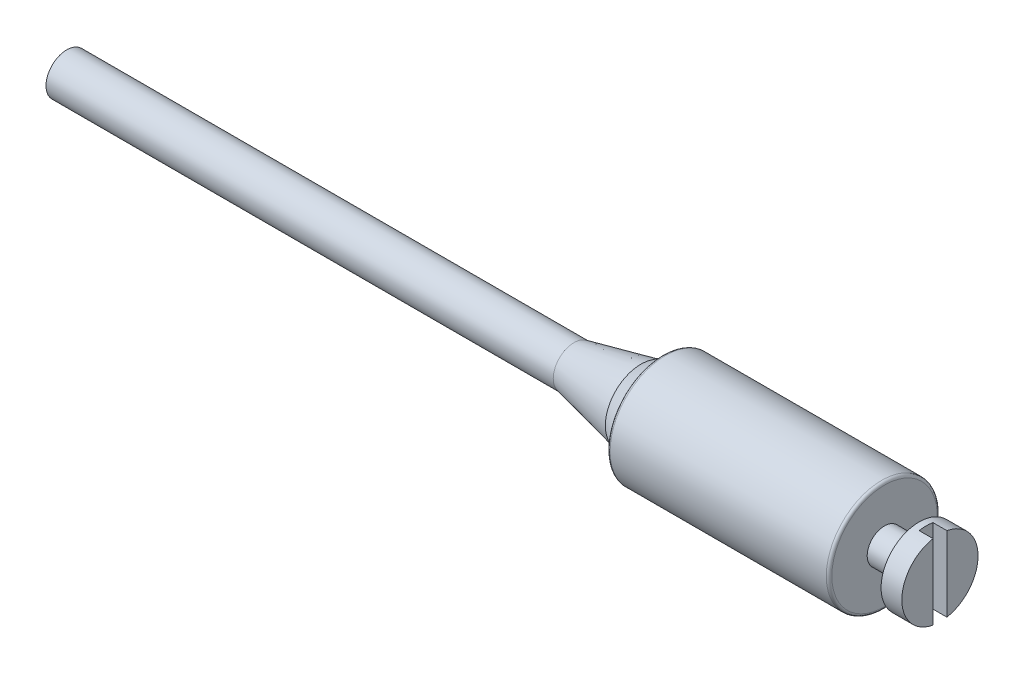
ISO-10303-21;
HEADER;
FILE_DESCRIPTION(('STEP AP214'),'2;1');
FILE_NAME('part.step','',(''),(''),'','','');
FILE_SCHEMA(('AUTOMOTIVE_DESIGN { 1 0 10303 214 1 1 1 1 }'));
ENDSEC;
DATA;
#1=APPLICATION_CONTEXT('core data for automotive mechanical design processes');
#2=APPLICATION_PROTOCOL_DEFINITION('international standard','automotive_design',2000,#1);
#3=PRODUCT_CONTEXT('',#1,'mechanical');
#4=PRODUCT('Part','Part','',(#3));
#5=PRODUCT_RELATED_PRODUCT_CATEGORY('part','',(#4));
#6=PRODUCT_DEFINITION_FORMATION('','',#4);
#7=PRODUCT_DEFINITION_CONTEXT('part definition',#1,'design');
#8=PRODUCT_DEFINITION('design','',#6,#7);
#9=PRODUCT_DEFINITION_SHAPE('','',#8);
#10=(LENGTH_UNIT() NAMED_UNIT(*) SI_UNIT(.MILLI.,.METRE.));
#11=(NAMED_UNIT(*) PLANE_ANGLE_UNIT() SI_UNIT($,.RADIAN.));
#12=(NAMED_UNIT(*) SI_UNIT($,.STERADIAN.) SOLID_ANGLE_UNIT());
#13=UNCERTAINTY_MEASURE_WITH_UNIT(LENGTH_MEASURE(1.E-05),#10,'distance_accuracy_value','');
#14=(GEOMETRIC_REPRESENTATION_CONTEXT(3) GLOBAL_UNCERTAINTY_ASSIGNED_CONTEXT((#13)) GLOBAL_UNIT_ASSIGNED_CONTEXT((#10,
#11,#12)) REPRESENTATION_CONTEXT('',''));
#15=CARTESIAN_POINT('',(0.,0.,0.));
#16=DIRECTION('',(0.,0.,1.));
#17=DIRECTION('',(1.,0.,0.));
#18=AXIS2_PLACEMENT_3D('',#15,#16,#17);
#19=CARTESIAN_POINT('',(20.,0.,0.));
#20=DIRECTION('',(-1.,0.,0.));
#21=DIRECTION('',(0.,0.,1.));
#22=AXIS2_PLACEMENT_3D('',#19,#20,#21);
#23=PLANE('',#22);
#24=CARTESIAN_POINT('',(20.,0.,0.));
#25=DIRECTION('',(-1.,0.,0.));
#26=DIRECTION('',(0.,0.,1.));
#27=AXIS2_PLACEMENT_3D('',#24,#25,#26);
#28=CIRCLE('',#27,2.75);
#29=CARTESIAN_POINT('',(20.,-2.70416345659799,0.5));
#30=VERTEX_POINT('',#29);
#31=CARTESIAN_POINT('',(20.,2.70416345659799,0.5));
#32=VERTEX_POINT('',#31);
#33=EDGE_CURVE('E90',#30,#32,#28,.T.);
#34=ORIENTED_EDGE('',*,*,#33,.F.);
#35=DIRECTION('',(0.,-1.,0.));
#36=VECTOR('',#35,1.);
#37=CARTESIAN_POINT('',(20.,-2.99260677888091,0.5));
#38=LINE('',#37,#36);
#39=EDGE_CURVE('E83',#32,#30,#38,.T.);
#40=ORIENTED_EDGE('',*,*,#39,.F.);
#41=EDGE_LOOP('',(#34,#40));
#42=FACE_BOUND('',#41,.T.);
#43=ADVANCED_FACE('F41',(#42),#23,.F.);
#44=CARTESIAN_POINT('',(-43.,1.5,0.));
#45=DIRECTION('',(1.,0.,0.));
#46=DIRECTION('',(0.,0.,-1.));
#47=AXIS2_PLACEMENT_3D('',#44,#45,#46);
#48=PLANE('',#47);
#49=CARTESIAN_POINT('',(-43.,0.,0.));
#50=DIRECTION('',(-1.,0.,0.));
#51=DIRECTION('',(0.,0.,1.));
#52=AXIS2_PLACEMENT_3D('',#49,#50,#51);
#53=CIRCLE('',#52,1.5);
#54=CARTESIAN_POINT('',(-43.,0.,1.5));
#55=VERTEX_POINT('',#54);
#56=EDGE_CURVE('E141',#55,#55,#53,.T.);
#57=ORIENTED_EDGE('',*,*,#56,.T.);
#58=EDGE_LOOP('',(#57));
#59=FACE_BOUND('',#58,.T.);
#60=ADVANCED_FACE('F183',(#59),#48,.F.);
#61=CARTESIAN_POINT('',(20.,2.70416345659799,-0.5));
#62=VERTEX_POINT('',#61);
#63=CARTESIAN_POINT('',(20.,-2.70416345659799,-0.5));
#64=VERTEX_POINT('',#63);
#65=EDGE_CURVE('E99',#62,#64,#28,.T.);
#66=ORIENTED_EDGE('',*,*,#65,.F.);
#67=DIRECTION('',(0.,1.,0.));
#68=VECTOR('',#67,1.);
#69=CARTESIAN_POINT('',(20.,-2.99260677888091,-0.5));
#70=LINE('',#69,#68);
#71=EDGE_CURVE('E92',#64,#62,#70,.T.);
#72=ORIENTED_EDGE('',*,*,#71,.F.);
#73=EDGE_LOOP('',(#66,#72));
#74=FACE_BOUND('',#73,.T.);
#75=ADVANCED_FACE('F178',(#74),#23,.F.);
#76=CARTESIAN_POINT('',(-43.,0.,0.));
#77=DIRECTION('',(-1.,0.,0.));
#78=DIRECTION('',(0.,0.,1.));
#79=AXIS2_PLACEMENT_3D('',#76,#77,#78);
#80=CYLINDRICAL_SURFACE('',#79,2.75);
#81=ORIENTED_EDGE('',*,*,#33,.T.);
#82=DIRECTION('',(-1.,0.,0.));
#83=VECTOR('',#82,1.);
#84=CARTESIAN_POINT('',(-43.,2.70416345659799,0.5));
#85=LINE('',#84,#83);
#86=CARTESIAN_POINT('',(19.,2.70416345659799,0.5));
#87=VERTEX_POINT('',#86);
#88=EDGE_CURVE('E11',#32,#87,#85,.T.);
#89=ORIENTED_EDGE('',*,*,#88,.T.);
#90=CARTESIAN_POINT('',(19.,0.,0.));
#91=DIRECTION('',(-1.,0.,0.));
#92=DIRECTION('',(0.,0.,1.));
#93=AXIS2_PLACEMENT_3D('',#90,#91,#92);
#94=CIRCLE('',#93,2.75);
#95=CARTESIAN_POINT('',(19.,2.70416345659799,-0.5));
#96=VERTEX_POINT('',#95);
#97=EDGE_CURVE('E130',#87,#96,#94,.T.);
#98=ORIENTED_EDGE('',*,*,#97,.T.);
#99=DIRECTION('',(-1.,0.,0.));
#100=VECTOR('',#99,1.);
#101=CARTESIAN_POINT('',(-43.,2.70416345659799,-0.5));
#102=LINE('',#101,#100);
#103=EDGE_CURVE('E50',#96,#62,#102,.F.);
#104=ORIENTED_EDGE('',*,*,#103,.T.);
#105=ORIENTED_EDGE('',*,*,#65,.T.);
#106=DIRECTION('',(-1.,0.,0.));
#107=VECTOR('',#106,1.);
#108=CARTESIAN_POINT('',(-43.,-2.70416345659799,-0.5));
#109=LINE('',#108,#107);
#110=CARTESIAN_POINT('',(19.,-2.70416345659799,-0.5));
#111=VERTEX_POINT('',#110);
#112=EDGE_CURVE('E129',#64,#111,#109,.T.);
#113=ORIENTED_EDGE('',*,*,#112,.T.);
#114=CARTESIAN_POINT('',(19.,-2.70416345659799,0.5));
#115=VERTEX_POINT('',#114);
#116=EDGE_CURVE('E126',#111,#115,#94,.T.);
#117=ORIENTED_EDGE('',*,*,#116,.T.);
#118=DIRECTION('',(-1.,0.,0.));
#119=VECTOR('',#118,1.);
#120=CARTESIAN_POINT('',(-43.,-2.70416345659799,0.5));
#121=LINE('',#120,#119);
#122=EDGE_CURVE('E97',#115,#30,#121,.F.);
#123=ORIENTED_EDGE('',*,*,#122,.T.);
#124=EDGE_LOOP('',(#81,#89,#98,#104,#105,#113,#117,#123));
#125=FACE_BOUND('',#124,.T.);
#126=CARTESIAN_POINT('',(18.5,0.,0.));
#127=DIRECTION('',(-1.,0.,0.));
#128=DIRECTION('',(0.,0.,1.));
#129=AXIS2_PLACEMENT_3D('',#126,#127,#128);
#130=CIRCLE('',#129,2.75);
#131=CARTESIAN_POINT('',(18.5,0.,2.75));
#132=VERTEX_POINT('',#131);
#133=EDGE_CURVE('E100',#132,#132,#130,.T.);
#134=ORIENTED_EDGE('',*,*,#133,.F.);
#135=EDGE_LOOP('',(#134));
#136=FACE_BOUND('',#135,.T.);
#137=ADVANCED_FACE('F94',(#125,#136),#80,.T.);
#138=CARTESIAN_POINT('',(18.5,2.75,0.));
#139=DIRECTION('',(1.,0.,0.));
#140=DIRECTION('',(0.,0.,-1.));
#141=AXIS2_PLACEMENT_3D('',#138,#139,#140);
#142=PLANE('',#141);
#143=CARTESIAN_POINT('',(18.5,0.,0.));
#144=DIRECTION('',(-1.,0.,0.));
#145=DIRECTION('',(0.,0.,1.));
#146=AXIS2_PLACEMENT_3D('',#143,#144,#145);
#147=CIRCLE('',#146,1.25);
#148=CARTESIAN_POINT('',(18.5,0.,1.25));
#149=VERTEX_POINT('',#148);
#150=EDGE_CURVE('E107',#149,#149,#147,.T.);
#151=ORIENTED_EDGE('',*,*,#150,.F.);
#152=EDGE_LOOP('',(#151));
#153=FACE_BOUND('',#152,.T.);
#154=ORIENTED_EDGE('',*,*,#133,.T.);
#155=EDGE_LOOP('',(#154));
#156=FACE_BOUND('',#155,.T.);
#157=ADVANCED_FACE('F172',(#153,#156),#142,.F.);
#158=CARTESIAN_POINT('',(-43.,0.,0.));
#159=DIRECTION('',(-1.,0.,0.));
#160=DIRECTION('',(0.,0.,1.));
#161=AXIS2_PLACEMENT_3D('',#158,#159,#160);
#162=CYLINDRICAL_SURFACE('',#161,1.25);
#163=CARTESIAN_POINT('',(16.,0.,0.));
#164=DIRECTION('',(-1.,0.,0.));
#165=DIRECTION('',(0.,0.,1.));
#166=AXIS2_PLACEMENT_3D('',#163,#164,#165);
#167=CIRCLE('',#166,1.25);
#168=CARTESIAN_POINT('',(16.,0.,1.25));
#169=VERTEX_POINT('',#168);
#170=EDGE_CURVE('E163',#169,#169,#167,.T.);
#171=ORIENTED_EDGE('',*,*,#170,.F.);
#172=EDGE_LOOP('',(#171));
#173=FACE_BOUND('',#172,.T.);
#174=ORIENTED_EDGE('',*,*,#150,.T.);
#175=EDGE_LOOP('',(#174));
#176=FACE_BOUND('',#175,.T.);
#177=ADVANCED_FACE('F170',(#173,#176),#162,.T.);
#178=CARTESIAN_POINT('',(16.,1.25,0.));
#179=DIRECTION('',(-1.,0.,0.));
#180=DIRECTION('',(0.,0.,1.));
#181=AXIS2_PLACEMENT_3D('',#178,#179,#180);
#182=PLANE('',#181);
#183=CARTESIAN_POINT('',(16.,0.,0.));
#184=DIRECTION('',(-1.,0.,0.));
#185=DIRECTION('',(0.,0.,1.));
#186=AXIS2_PLACEMENT_3D('',#183,#184,#185);
#187=CIRCLE('',#186,3.8);
#188=CARTESIAN_POINT('',(16.,0.,3.8));
#189=VERTEX_POINT('',#188);
#190=EDGE_CURVE('E118',#189,#189,#187,.F.);
#191=ORIENTED_EDGE('',*,*,#190,.T.);
#192=EDGE_LOOP('',(#191));
#193=FACE_BOUND('',#192,.T.);
#194=ORIENTED_EDGE('',*,*,#170,.T.);
#195=EDGE_LOOP('',(#194));
#196=FACE_BOUND('',#195,.T.);
#197=ADVANCED_FACE('F212',(#193,#196),#182,.F.);
#198=CARTESIAN_POINT('',(-43.,0.,0.));
#199=DIRECTION('',(-1.,0.,0.));
#200=DIRECTION('',(0.,0.,1.));
#201=AXIS2_PLACEMENT_3D('',#198,#199,#200);
#202=CYLINDRICAL_SURFACE('',#201,4.);
#203=CARTESIAN_POINT('',(15.8,0.,0.));
#204=DIRECTION('',(-1.,0.,0.));
#205=DIRECTION('',(0.,0.,1.));
#206=AXIS2_PLACEMENT_3D('',#203,#204,#205);
#207=CIRCLE('',#206,4.);
#208=CARTESIAN_POINT('',(15.8,0.,4.));
#209=VERTEX_POINT('',#208);
#210=EDGE_CURVE('E114',#209,#209,#207,.T.);
#211=ORIENTED_EDGE('',*,*,#210,.T.);
#212=EDGE_LOOP('',(#211));
#213=FACE_BOUND('',#212,.T.);
#214=CARTESIAN_POINT('',(0.199999999999999,0.,0.));
#215=DIRECTION('',(1.,0.,0.));
#216=DIRECTION('',(0.,0.,-1.));
#217=AXIS2_PLACEMENT_3D('',#214,#215,#216);
#218=CIRCLE('',#217,4.);
#219=CARTESIAN_POINT('',(0.199999999999999,0.,-4.));
#220=VERTEX_POINT('',#219);
#221=EDGE_CURVE('E105',#220,#220,#218,.T.);
#222=ORIENTED_EDGE('',*,*,#221,.T.);
#223=EDGE_LOOP('',(#222));
#224=FACE_BOUND('',#223,.T.);
#225=ADVANCED_FACE('F208',(#213,#224),#202,.T.);
#226=CARTESIAN_POINT('',(0.,4.,0.));
#227=DIRECTION('',(1.,0.,0.));
#228=DIRECTION('',(0.,0.,-1.));
#229=AXIS2_PLACEMENT_3D('',#226,#227,#228);
#230=PLANE('',#229);
#231=CARTESIAN_POINT('',(0.,0.,0.));
#232=DIRECTION('',(1.,0.,0.));
#233=DIRECTION('',(0.,0.,-1.));
#234=AXIS2_PLACEMENT_3D('',#231,#232,#233);
#235=CIRCLE('',#234,3.8);
#236=CARTESIAN_POINT('',(0.,0.,-3.8));
#237=VERTEX_POINT('',#236);
#238=EDGE_CURVE('E122',#237,#237,#235,.F.);
#239=ORIENTED_EDGE('',*,*,#238,.T.);
#240=EDGE_LOOP('',(#239));
#241=FACE_BOUND('',#240,.T.);
#242=CARTESIAN_POINT('',(0.,0.,0.));
#243=DIRECTION('',(-1.,0.,0.));
#244=DIRECTION('',(0.,0.,1.));
#245=AXIS2_PLACEMENT_3D('',#242,#243,#244);
#246=CIRCLE('',#245,3.60331376711098);
#247=CARTESIAN_POINT('',(0.,0.,3.60331376711098));
#248=VERTEX_POINT('',#247);
#249=EDGE_CURVE('E159',#248,#248,#246,.T.);
#250=ORIENTED_EDGE('',*,*,#249,.F.);
#251=EDGE_LOOP('',(#250));
#252=FACE_BOUND('',#251,.T.);
#253=ADVANCED_FACE('F211',(#241,#252),#230,.F.);
#254=CARTESIAN_POINT('',(0.,0.,0.));
#255=DIRECTION('',(1.,0.,0.));
#256=DIRECTION('',(0.,0.,-1.));
#257=AXIS2_PLACEMENT_3D('',#254,#255,#256);
#258=CONICAL_SURFACE('',#257,3.60331376711098,0.582653754079011);
#259=CARTESIAN_POINT('',(-1.5817655829436,0.,0.));
#260=DIRECTION('',(-1.,0.,0.));
#261=DIRECTION('',(0.,0.,1.));
#262=AXIS2_PLACEMENT_3D('',#259,#260,#261);
#263=CIRCLE('',#262,2.56098097474928);
#264=CARTESIAN_POINT('',(-1.5817655829436,0.,2.56098097474928));
#265=VERTEX_POINT('',#264);
#266=EDGE_CURVE('E155',#265,#265,#263,.T.);
#267=ORIENTED_EDGE('',*,*,#266,.F.);
#268=EDGE_LOOP('',(#267));
#269=FACE_BOUND('',#268,.T.);
#270=ORIENTED_EDGE('',*,*,#249,.T.);
#271=EDGE_LOOP('',(#270));
#272=FACE_BOUND('',#271,.T.);
#273=ADVANCED_FACE('F220',(#269,#272),#258,.T.);
#274=CARTESIAN_POINT('',(-1.5817655829436,0.,0.));
#275=DIRECTION('',(1.,0.,0.));
#276=DIRECTION('',(0.,0.,-1.));
#277=AXIS2_PLACEMENT_3D('',#274,#275,#276);
#278=CONICAL_SURFACE('',#277,2.56098097474928,0.21663090291821);
#279=CARTESIAN_POINT('',(-6.40255474761646,0.,0.));
#280=DIRECTION('',(-1.,0.,0.));
#281=DIRECTION('',(0.,0.,1.));
#282=AXIS2_PLACEMENT_3D('',#279,#280,#281);
#283=CIRCLE('',#282,1.5);
#284=CARTESIAN_POINT('',(-6.40255474761646,0.,1.5));
#285=VERTEX_POINT('',#284);
#286=EDGE_CURVE('E146',#285,#285,#283,.T.);
#287=ORIENTED_EDGE('',*,*,#286,.F.);
#288=EDGE_LOOP('',(#287));
#289=FACE_BOUND('',#288,.T.);
#290=ORIENTED_EDGE('',*,*,#266,.T.);
#291=EDGE_LOOP('',(#290));
#292=FACE_BOUND('',#291,.T.);
#293=ADVANCED_FACE('F201',(#289,#292),#278,.T.);
#294=CARTESIAN_POINT('',(-43.,0.,0.));
#295=DIRECTION('',(-1.,0.,0.));
#296=DIRECTION('',(0.,0.,1.));
#297=AXIS2_PLACEMENT_3D('',#294,#295,#296);
#298=CYLINDRICAL_SURFACE('',#297,1.5);
#299=ORIENTED_EDGE('',*,*,#56,.F.);
#300=EDGE_LOOP('',(#299));
#301=FACE_BOUND('',#300,.T.);
#302=ORIENTED_EDGE('',*,*,#286,.T.);
#303=EDGE_LOOP('',(#302));
#304=FACE_BOUND('',#303,.T.);
#305=ADVANCED_FACE('F194',(#301,#304),#298,.T.);
#306=CARTESIAN_POINT('',(15.8,0.,0.));
#307=DIRECTION('',(-1.,0.,0.));
#308=DIRECTION('',(0.,0.,1.));
#309=AXIS2_PLACEMENT_3D('',#306,#307,#308);
#310=TOROIDAL_SURFACE('',#309,3.8,0.2);
#311=ORIENTED_EDGE('',*,*,#190,.F.);
#312=EDGE_LOOP('',(#311));
#313=FACE_BOUND('',#312,.T.);
#314=ORIENTED_EDGE('',*,*,#210,.F.);
#315=EDGE_LOOP('',(#314));
#316=FACE_BOUND('',#315,.T.);
#317=ADVANCED_FACE('F192',(#313,#316),#310,.T.);
#318=CARTESIAN_POINT('',(0.199999999999999,0.,0.));
#319=DIRECTION('',(1.,0.,0.));
#320=DIRECTION('',(0.,0.,-1.));
#321=AXIS2_PLACEMENT_3D('',#318,#319,#320);
#322=TOROIDAL_SURFACE('',#321,3.8,0.2);
#323=ORIENTED_EDGE('',*,*,#221,.F.);
#324=EDGE_LOOP('',(#323));
#325=FACE_BOUND('',#324,.T.);
#326=ORIENTED_EDGE('',*,*,#238,.F.);
#327=EDGE_LOOP('',(#326));
#328=FACE_BOUND('',#327,.T.);
#329=ADVANCED_FACE('F43',(#325,#328),#322,.T.);
#330=CARTESIAN_POINT('',(19.,-2.99260677888091,0.5));
#331=DIRECTION('',(0.,0.,1.));
#332=DIRECTION('',(1.,0.,0.));
#333=AXIS2_PLACEMENT_3D('',#330,#331,#332);
#334=PLANE('',#333);
#335=ORIENTED_EDGE('',*,*,#39,.T.);
#336=ORIENTED_EDGE('',*,*,#122,.F.);
#337=DIRECTION('',(0.,-1.,0.));
#338=VECTOR('',#337,1.);
#339=CARTESIAN_POINT('',(19.,-2.99260677888091,0.5));
#340=LINE('',#339,#338);
#341=EDGE_CURVE('E57',#87,#115,#340,.T.);
#342=ORIENTED_EDGE('',*,*,#341,.F.);
#343=ORIENTED_EDGE('',*,*,#88,.F.);
#344=EDGE_LOOP('',(#335,#336,#342,#343));
#345=FACE_BOUND('',#344,.T.);
#346=ADVANCED_FACE('F82',(#345),#334,.F.);
#347=CARTESIAN_POINT('',(19.,-2.99260677888091,-0.5));
#348=DIRECTION('',(0.,0.,-1.));
#349=DIRECTION('',(-1.,0.,0.));
#350=AXIS2_PLACEMENT_3D('',#347,#348,#349);
#351=PLANE('',#350);
#352=ORIENTED_EDGE('',*,*,#71,.T.);
#353=ORIENTED_EDGE('',*,*,#103,.F.);
#354=DIRECTION('',(0.,1.,0.));
#355=VECTOR('',#354,1.);
#356=CARTESIAN_POINT('',(19.,-2.99260677888091,-0.5));
#357=LINE('',#356,#355);
#358=EDGE_CURVE('E139',#111,#96,#357,.T.);
#359=ORIENTED_EDGE('',*,*,#358,.F.);
#360=ORIENTED_EDGE('',*,*,#112,.F.);
#361=EDGE_LOOP('',(#352,#353,#359,#360));
#362=FACE_BOUND('',#361,.T.);
#363=ADVANCED_FACE('F309',(#362),#351,.F.);
#364=CARTESIAN_POINT('',(19.,0.,0.));
#365=DIRECTION('',(-1.,0.,0.));
#366=DIRECTION('',(0.,0.,1.));
#367=AXIS2_PLACEMENT_3D('',#364,#365,#366);
#368=PLANE('',#367);
#369=ORIENTED_EDGE('',*,*,#341,.T.);
#370=ORIENTED_EDGE('',*,*,#116,.F.);
#371=ORIENTED_EDGE('',*,*,#358,.T.);
#372=ORIENTED_EDGE('',*,*,#97,.F.);
#373=EDGE_LOOP('',(#369,#370,#371,#372));
#374=FACE_BOUND('',#373,.T.);
#375=ADVANCED_FACE('F138',(#374),#368,.F.);
#376=CLOSED_SHELL('',(#43,#60,#75,#137,#157,#177,#197,#225,#253,#273,#293,#305,#317,#329,#346,
#363,#375));
#377=MANIFOLD_SOLID_BREP('B2',#376);
#378=ADVANCED_BREP_SHAPE_REPRESENTATION('',(#18,#377),#14);
#379=SHAPE_DEFINITION_REPRESENTATION(#9,#378);
ENDSEC;
END-ISO-10303-21;
